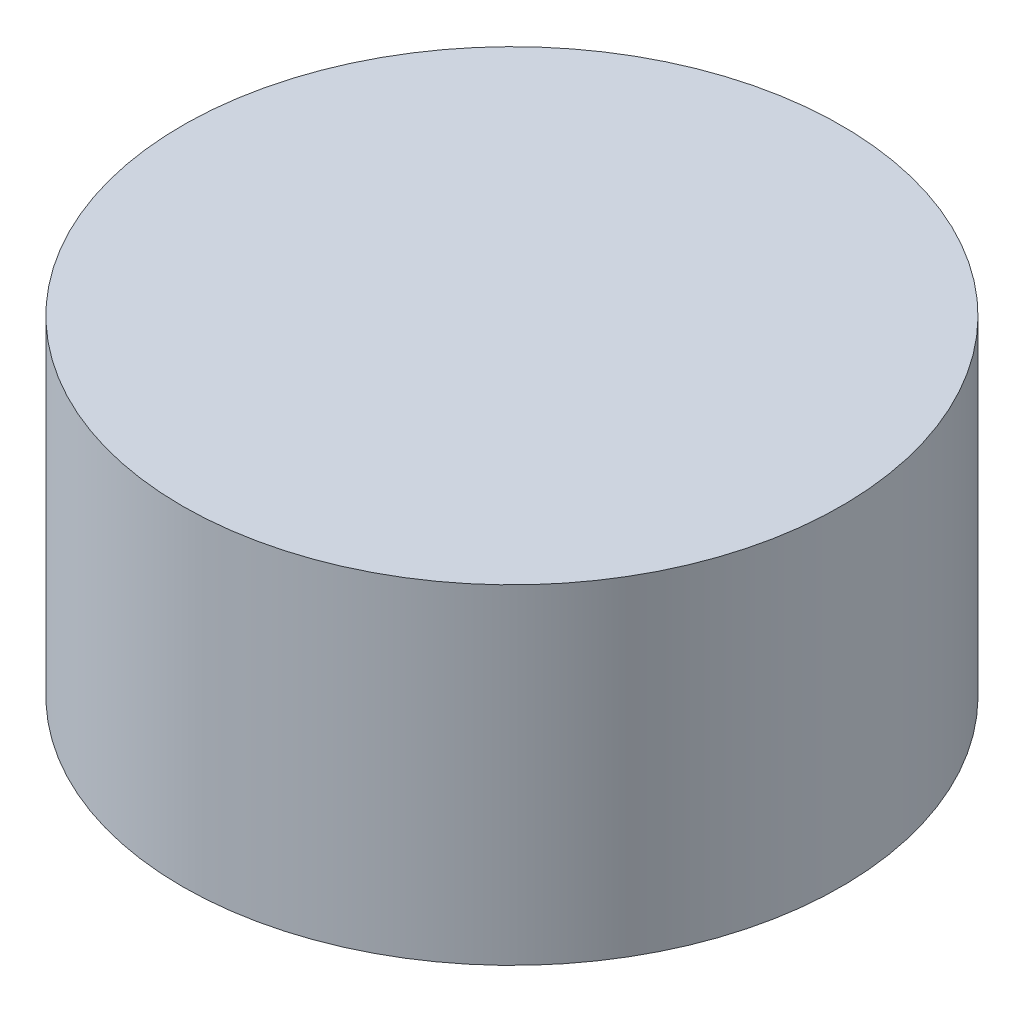
ISO-10303-21;
HEADER;
FILE_DESCRIPTION(('STEP AP214'),'2;1');
FILE_NAME('part.step','',(''),(''),'','','');
FILE_SCHEMA(('AUTOMOTIVE_DESIGN { 1 0 10303 214 1 1 1 1 }'));
ENDSEC;
DATA;
#1=APPLICATION_CONTEXT('core data for automotive mechanical design processes');
#2=APPLICATION_PROTOCOL_DEFINITION('international standard','automotive_design',2000,#1);
#3=PRODUCT_CONTEXT('',#1,'mechanical');
#4=PRODUCT('Part','Part','',(#3));
#5=PRODUCT_RELATED_PRODUCT_CATEGORY('part','',(#4));
#6=PRODUCT_DEFINITION_FORMATION('','',#4);
#7=PRODUCT_DEFINITION_CONTEXT('part definition',#1,'design');
#8=PRODUCT_DEFINITION('design','',#6,#7);
#9=PRODUCT_DEFINITION_SHAPE('','',#8);
#10=(LENGTH_UNIT() NAMED_UNIT(*) SI_UNIT(.MILLI.,.METRE.));
#11=(NAMED_UNIT(*) PLANE_ANGLE_UNIT() SI_UNIT($,.RADIAN.));
#12=(NAMED_UNIT(*) SI_UNIT($,.STERADIAN.) SOLID_ANGLE_UNIT());
#13=UNCERTAINTY_MEASURE_WITH_UNIT(LENGTH_MEASURE(1.E-05),#10,'distance_accuracy_value','');
#14=(GEOMETRIC_REPRESENTATION_CONTEXT(3) GLOBAL_UNCERTAINTY_ASSIGNED_CONTEXT((#13)) GLOBAL_UNIT_ASSIGNED_CONTEXT((#10,
#11,#12)) REPRESENTATION_CONTEXT('',''));
#15=CARTESIAN_POINT('',(0.,0.,0.));
#16=DIRECTION('',(0.,0.,1.));
#17=DIRECTION('',(1.,0.,0.));
#18=AXIS2_PLACEMENT_3D('',#15,#16,#17);
#19=CARTESIAN_POINT('',(0.,46.,0.));
#20=DIRECTION('',(0.,-1.,0.));
#21=DIRECTION('',(0.,0.,-1.));
#22=AXIS2_PLACEMENT_3D('',#19,#20,#21);
#23=CYLINDRICAL_SURFACE('',#22,46.);
#24=CARTESIAN_POINT('',(0.,46.,0.));
#25=DIRECTION('',(0.,1.,0.));
#26=DIRECTION('',(0.,0.,1.));
#27=AXIS2_PLACEMENT_3D('',#24,#25,#26);
#28=CIRCLE('',#27,46.);
#29=CARTESIAN_POINT('',(0.,46.,46.));
#30=VERTEX_POINT('',#29);
#31=EDGE_CURVE('E10',#30,#30,#28,.T.);
#32=ORIENTED_EDGE('',*,*,#31,.F.);
#33=EDGE_LOOP('',(#32));
#34=FACE_BOUND('',#33,.T.);
#35=CARTESIAN_POINT('',(0.,0.,0.));
#36=DIRECTION('',(0.,1.,0.));
#37=DIRECTION('',(0.,0.,1.));
#38=AXIS2_PLACEMENT_3D('',#35,#36,#37);
#39=CIRCLE('',#38,46.);
#40=CARTESIAN_POINT('',(0.,0.,46.));
#41=VERTEX_POINT('',#40);
#42=EDGE_CURVE('E46',#41,#41,#39,.T.);
#43=ORIENTED_EDGE('',*,*,#42,.T.);
#44=EDGE_LOOP('',(#43));
#45=FACE_BOUND('',#44,.T.);
#46=ADVANCED_FACE('F43',(#34,#45),#23,.T.);
#47=CARTESIAN_POINT('',(0.,46.,0.));
#48=DIRECTION('',(0.,1.,0.));
#49=DIRECTION('',(0.,0.,1.));
#50=AXIS2_PLACEMENT_3D('',#47,#48,#49);
#51=PLANE('',#50);
#52=ORIENTED_EDGE('',*,*,#31,.T.);
#53=EDGE_LOOP('',(#52));
#54=FACE_BOUND('',#53,.T.);
#55=ADVANCED_FACE('F60',(#54),#51,.T.);
#56=CARTESIAN_POINT('',(0.,0.,0.));
#57=DIRECTION('',(0.,1.,0.));
#58=DIRECTION('',(0.,0.,1.));
#59=AXIS2_PLACEMENT_3D('',#56,#57,#58);
#60=PLANE('',#59);
#61=ORIENTED_EDGE('',*,*,#42,.F.);
#62=EDGE_LOOP('',(#61));
#63=FACE_BOUND('',#62,.T.);
#64=ADVANCED_FACE('F58',(#63),#60,.F.);
#65=CLOSED_SHELL('',(#46,#55,#64));
#66=MANIFOLD_SOLID_BREP('B2',#65);
#67=ADVANCED_BREP_SHAPE_REPRESENTATION('',(#18,#66),#14);
#68=SHAPE_DEFINITION_REPRESENTATION(#9,#67);
ENDSEC;
END-ISO-10303-21;
